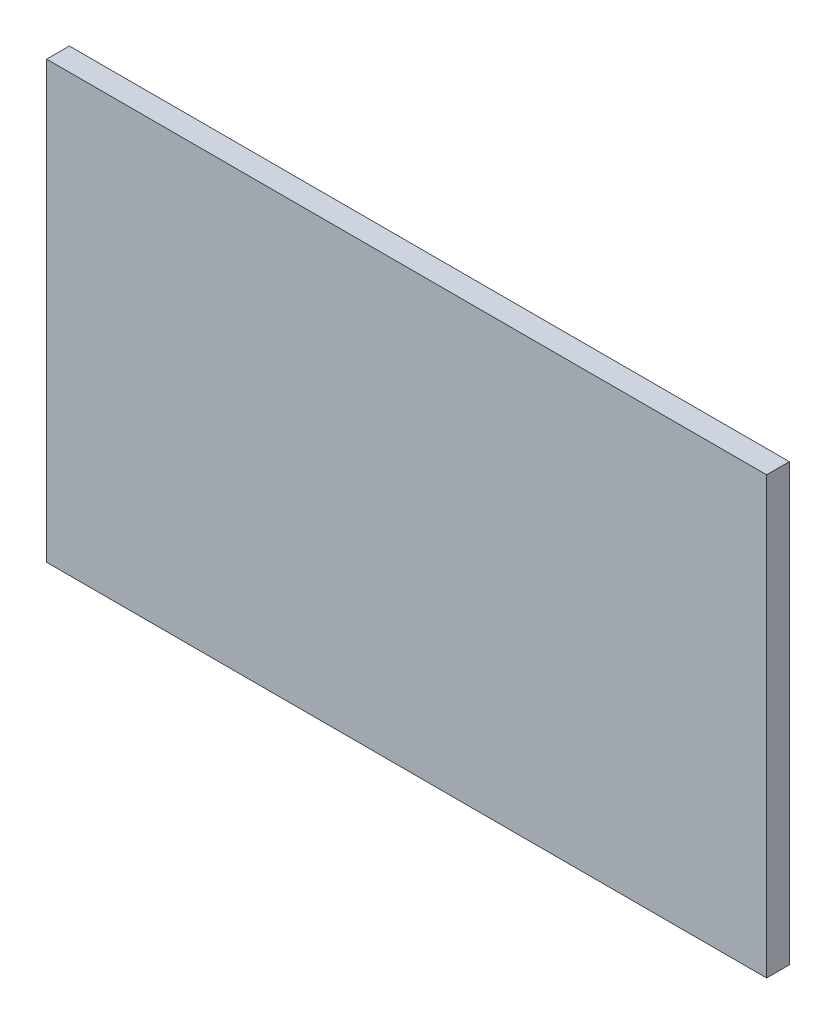
ISO-10303-21;
HEADER;
FILE_DESCRIPTION(('STEP AP214'),'2;1');
FILE_NAME('part.step','',(''),(''),'','','');
FILE_SCHEMA(('AUTOMOTIVE_DESIGN { 1 0 10303 214 1 1 1 1 }'));
ENDSEC;
DATA;
#1=APPLICATION_CONTEXT('core data for automotive mechanical design processes');
#2=APPLICATION_PROTOCOL_DEFINITION('international standard','automotive_design',2000,#1);
#3=PRODUCT_CONTEXT('',#1,'mechanical');
#4=PRODUCT('Part','Part','',(#3));
#5=PRODUCT_RELATED_PRODUCT_CATEGORY('part','',(#4));
#6=PRODUCT_DEFINITION_FORMATION('','',#4);
#7=PRODUCT_DEFINITION_CONTEXT('part definition',#1,'design');
#8=PRODUCT_DEFINITION('design','',#6,#7);
#9=PRODUCT_DEFINITION_SHAPE('','',#8);
#10=(LENGTH_UNIT() NAMED_UNIT(*) SI_UNIT(.MILLI.,.METRE.));
#11=(NAMED_UNIT(*) PLANE_ANGLE_UNIT() SI_UNIT($,.RADIAN.));
#12=(NAMED_UNIT(*) SI_UNIT($,.STERADIAN.) SOLID_ANGLE_UNIT());
#13=UNCERTAINTY_MEASURE_WITH_UNIT(LENGTH_MEASURE(1.E-05),#10,'distance_accuracy_value','');
#14=(GEOMETRIC_REPRESENTATION_CONTEXT(3) GLOBAL_UNCERTAINTY_ASSIGNED_CONTEXT((#13)) GLOBAL_UNIT_ASSIGNED_CONTEXT((#10,
#11,#12)) REPRESENTATION_CONTEXT('',''));
#15=CARTESIAN_POINT('',(0.,0.,0.));
#16=DIRECTION('',(0.,0.,1.));
#17=DIRECTION('',(1.,0.,0.));
#18=AXIS2_PLACEMENT_3D('',#15,#16,#17);
#19=CARTESIAN_POINT('',(0.,0.,0.06));
#20=DIRECTION('',(0.,0.,1.));
#21=DIRECTION('',(1.,0.,0.));
#22=AXIS2_PLACEMENT_3D('',#19,#20,#21);
#23=PLANE('',#22);
#24=DIRECTION('',(0.,1.,0.));
#25=VECTOR('',#24,1.);
#26=CARTESIAN_POINT('',(1.9,0.,0.06));
#27=LINE('',#26,#25);
#28=CARTESIAN_POINT('',(1.9,1.15,0.06));
#29=VERTEX_POINT('',#28);
#30=CARTESIAN_POINT('',(1.9,0.,0.06));
#31=VERTEX_POINT('',#30);
#32=EDGE_CURVE('E76',#29,#31,#27,.F.);
#33=ORIENTED_EDGE('',*,*,#32,.F.);
#34=DIRECTION('',(1.,0.,0.));
#35=VECTOR('',#34,1.);
#36=CARTESIAN_POINT('',(0.,1.15,0.06));
#37=LINE('',#36,#35);
#38=CARTESIAN_POINT('',(0.,1.15,0.06));
#39=VERTEX_POINT('',#38);
#40=EDGE_CURVE('E58',#39,#29,#37,.T.);
#41=ORIENTED_EDGE('',*,*,#40,.F.);
#42=DIRECTION('',(0.,1.,0.));
#43=VECTOR('',#42,1.);
#44=CARTESIAN_POINT('',(0.,0.,0.06));
#45=LINE('',#44,#43);
#46=CARTESIAN_POINT('',(0.,0.,0.06));
#47=VERTEX_POINT('',#46);
#48=EDGE_CURVE('E20',#39,#47,#45,.F.);
#49=ORIENTED_EDGE('',*,*,#48,.T.);
#50=DIRECTION('',(1.,0.,0.));
#51=VECTOR('',#50,1.);
#52=CARTESIAN_POINT('',(0.,0.,0.06));
#53=LINE('',#52,#51);
#54=EDGE_CURVE('E55',#47,#31,#53,.T.);
#55=ORIENTED_EDGE('',*,*,#54,.T.);
#56=EDGE_LOOP('',(#33,#41,#49,#55));
#57=FACE_BOUND('',#56,.T.);
#58=ADVANCED_FACE('F17',(#57),#23,.T.);
#59=CARTESIAN_POINT('',(0.,0.,0.));
#60=DIRECTION('',(1.,0.,0.));
#61=DIRECTION('',(0.,0.,-1.));
#62=AXIS2_PLACEMENT_3D('',#59,#60,#61);
#63=PLANE('',#62);
#64=DIRECTION('',(0.,0.,1.));
#65=VECTOR('',#64,1.);
#66=CARTESIAN_POINT('',(0.,1.15,0.));
#67=LINE('',#66,#65);
#68=CARTESIAN_POINT('',(0.,1.15,0.));
#69=VERTEX_POINT('',#68);
#70=EDGE_CURVE('E78',#69,#39,#67,.T.);
#71=ORIENTED_EDGE('',*,*,#70,.F.);
#72=DIRECTION('',(0.,1.,0.));
#73=VECTOR('',#72,1.);
#74=CARTESIAN_POINT('',(0.,0.,0.));
#75=LINE('',#74,#73);
#76=CARTESIAN_POINT('',(0.,0.,0.));
#77=VERTEX_POINT('',#76);
#78=EDGE_CURVE('E73',#69,#77,#75,.F.);
#79=ORIENTED_EDGE('',*,*,#78,.T.);
#80=DIRECTION('',(0.,0.,1.));
#81=VECTOR('',#80,1.);
#82=CARTESIAN_POINT('',(0.,0.,0.));
#83=LINE('',#82,#81);
#84=EDGE_CURVE('E63',#77,#47,#83,.T.);
#85=ORIENTED_EDGE('',*,*,#84,.T.);
#86=ORIENTED_EDGE('',*,*,#48,.F.);
#87=EDGE_LOOP('',(#71,#79,#85,#86));
#88=FACE_BOUND('',#87,.T.);
#89=ADVANCED_FACE('F72',(#88),#63,.F.);
#90=CARTESIAN_POINT('',(0.,0.,0.));
#91=DIRECTION('',(0.,1.,0.));
#92=DIRECTION('',(0.,0.,1.));
#93=AXIS2_PLACEMENT_3D('',#90,#91,#92);
#94=PLANE('',#93);
#95=ORIENTED_EDGE('',*,*,#54,.F.);
#96=ORIENTED_EDGE('',*,*,#84,.F.);
#97=DIRECTION('',(1.,0.,0.));
#98=VECTOR('',#97,1.);
#99=CARTESIAN_POINT('',(0.,0.,0.));
#100=LINE('',#99,#98);
#101=CARTESIAN_POINT('',(1.9,0.,0.));
#102=VERTEX_POINT('',#101);
#103=EDGE_CURVE('E83',#77,#102,#100,.T.);
#104=ORIENTED_EDGE('',*,*,#103,.T.);
#105=DIRECTION('',(0.,0.,-1.));
#106=VECTOR('',#105,1.);
#107=CARTESIAN_POINT('',(1.9,0.,0.));
#108=LINE('',#107,#106);
#109=EDGE_CURVE('E69',#31,#102,#108,.T.);
#110=ORIENTED_EDGE('',*,*,#109,.F.);
#111=EDGE_LOOP('',(#95,#96,#104,#110));
#112=FACE_BOUND('',#111,.T.);
#113=ADVANCED_FACE('F66',(#112),#94,.F.);
#114=CARTESIAN_POINT('',(1.9,0.,0.));
#115=DIRECTION('',(1.,0.,0.));
#116=DIRECTION('',(0.,0.,-1.));
#117=AXIS2_PLACEMENT_3D('',#114,#115,#116);
#118=PLANE('',#117);
#119=DIRECTION('',(0.,0.,1.));
#120=VECTOR('',#119,1.);
#121=CARTESIAN_POINT('',(1.9,1.15,0.));
#122=LINE('',#121,#120);
#123=CARTESIAN_POINT('',(1.9,1.15,0.));
#124=VERTEX_POINT('',#123);
#125=EDGE_CURVE('E34',#29,#124,#122,.F.);
#126=ORIENTED_EDGE('',*,*,#125,.F.);
#127=ORIENTED_EDGE('',*,*,#32,.T.);
#128=ORIENTED_EDGE('',*,*,#109,.T.);
#129=DIRECTION('',(0.,1.,0.));
#130=VECTOR('',#129,1.);
#131=CARTESIAN_POINT('',(1.9,0.,0.));
#132=LINE('',#131,#130);
#133=EDGE_CURVE('E26',#102,#124,#132,.T.);
#134=ORIENTED_EDGE('',*,*,#133,.T.);
#135=EDGE_LOOP('',(#126,#127,#128,#134));
#136=FACE_BOUND('',#135,.T.);
#137=ADVANCED_FACE('F88',(#136),#118,.T.);
#138=CARTESIAN_POINT('',(0.,1.15,0.));
#139=DIRECTION('',(0.,1.,0.));
#140=DIRECTION('',(0.,0.,1.));
#141=AXIS2_PLACEMENT_3D('',#138,#139,#140);
#142=PLANE('',#141);
#143=ORIENTED_EDGE('',*,*,#40,.T.);
#144=ORIENTED_EDGE('',*,*,#125,.T.);
#145=DIRECTION('',(1.,0.,0.));
#146=VECTOR('',#145,1.);
#147=CARTESIAN_POINT('',(0.,1.15,0.));
#148=LINE('',#147,#146);
#149=EDGE_CURVE('E11',#124,#69,#148,.F.);
#150=ORIENTED_EDGE('',*,*,#149,.T.);
#151=ORIENTED_EDGE('',*,*,#70,.T.);
#152=EDGE_LOOP('',(#143,#144,#150,#151));
#153=FACE_BOUND('',#152,.T.);
#154=ADVANCED_FACE('F91',(#153),#142,.T.);
#155=CARTESIAN_POINT('',(0.,0.,0.));
#156=DIRECTION('',(0.,0.,1.));
#157=DIRECTION('',(1.,0.,0.));
#158=AXIS2_PLACEMENT_3D('',#155,#156,#157);
#159=PLANE('',#158);
#160=ORIENTED_EDGE('',*,*,#133,.F.);
#161=ORIENTED_EDGE('',*,*,#103,.F.);
#162=ORIENTED_EDGE('',*,*,#78,.F.);
#163=ORIENTED_EDGE('',*,*,#149,.F.);
#164=EDGE_LOOP('',(#160,#161,#162,#163));
#165=FACE_BOUND('',#164,.T.);
#166=ADVANCED_FACE('F90',(#165),#159,.F.);
#167=CLOSED_SHELL('',(#58,#89,#113,#137,#154,#166));
#168=MANIFOLD_SOLID_BREP('B1',#167);
#169=ADVANCED_BREP_SHAPE_REPRESENTATION('',(#18,#168),#14);
#170=SHAPE_DEFINITION_REPRESENTATION(#9,#169);
ENDSEC;
END-ISO-10303-21;
